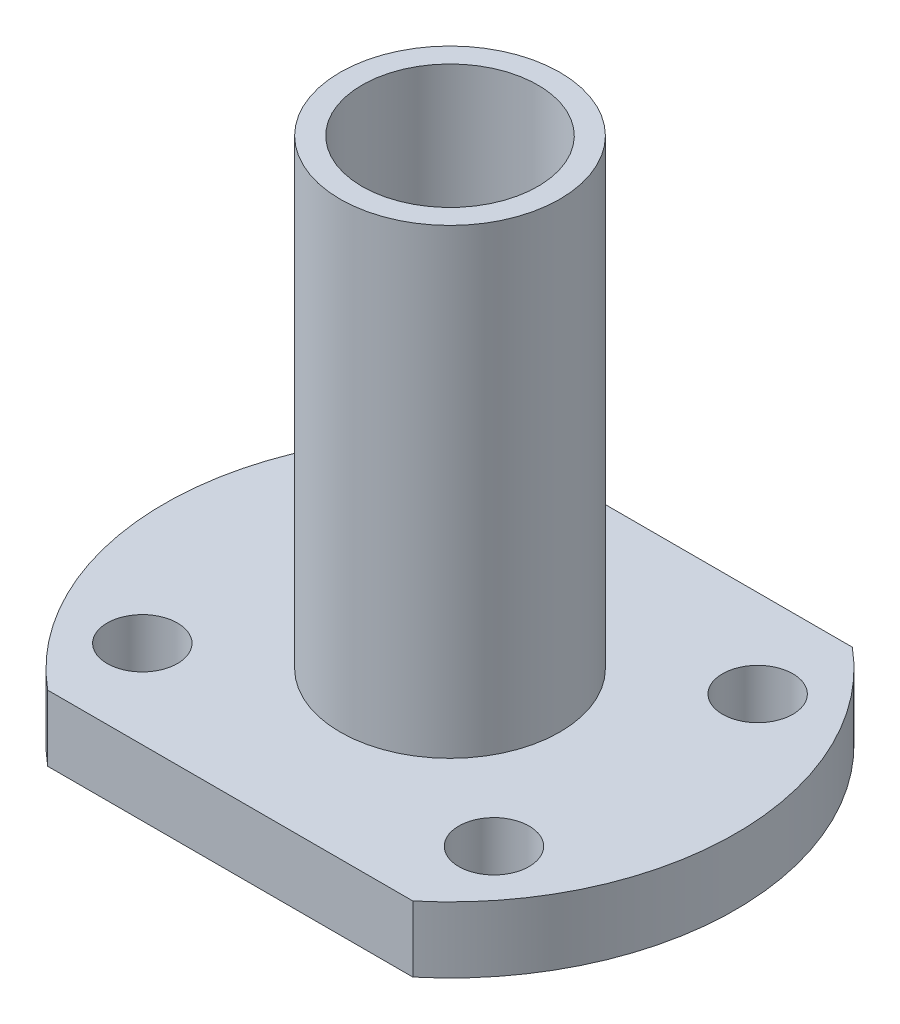
ISO-10303-21;
HEADER;
FILE_DESCRIPTION(('STEP AP214'),'2;1');
FILE_NAME('part.step','',(''),(''),'','','');
FILE_SCHEMA(('AUTOMOTIVE_DESIGN { 1 0 10303 214 1 1 1 1 }'));
ENDSEC;
DATA;
#1=APPLICATION_CONTEXT('core data for automotive mechanical design processes');
#2=APPLICATION_PROTOCOL_DEFINITION('international standard','automotive_design',2000,#1);
#3=PRODUCT_CONTEXT('',#1,'mechanical');
#4=PRODUCT('Part','Part','',(#3));
#5=PRODUCT_RELATED_PRODUCT_CATEGORY('part','',(#4));
#6=PRODUCT_DEFINITION_FORMATION('','',#4);
#7=PRODUCT_DEFINITION_CONTEXT('part definition',#1,'design');
#8=PRODUCT_DEFINITION('design','',#6,#7);
#9=PRODUCT_DEFINITION_SHAPE('','',#8);
#10=(LENGTH_UNIT() NAMED_UNIT(*) SI_UNIT(.MILLI.,.METRE.));
#11=(NAMED_UNIT(*) PLANE_ANGLE_UNIT() SI_UNIT($,.RADIAN.));
#12=(NAMED_UNIT(*) SI_UNIT($,.STERADIAN.) SOLID_ANGLE_UNIT());
#13=UNCERTAINTY_MEASURE_WITH_UNIT(LENGTH_MEASURE(1.E-05),#10,'distance_accuracy_value','');
#14=(GEOMETRIC_REPRESENTATION_CONTEXT(3) GLOBAL_UNCERTAINTY_ASSIGNED_CONTEXT((#13)) GLOBAL_UNIT_ASSIGNED_CONTEXT((#10,
#11,#12)) REPRESENTATION_CONTEXT('',''));
#15=CARTESIAN_POINT('',(0.,0.,0.));
#16=DIRECTION('',(0.,0.,1.));
#17=DIRECTION('',(1.,0.,0.));
#18=AXIS2_PLACEMENT_3D('',#15,#16,#17);
#19=CARTESIAN_POINT('',(0.,24.,0.));
#20=DIRECTION('',(0.,-1.,0.));
#21=DIRECTION('',(0.,0.,-1.));
#22=AXIS2_PLACEMENT_3D('',#19,#20,#21);
#23=CYLINDRICAL_SURFACE('',#22,5.);
#24=CARTESIAN_POINT('',(0.,3.,0.));
#25=DIRECTION('',(0.,1.,0.));
#26=DIRECTION('',(0.,0.,1.));
#27=AXIS2_PLACEMENT_3D('',#24,#25,#26);
#28=CIRCLE('',#27,5.);
#29=CARTESIAN_POINT('',(0.,3.,5.));
#30=VERTEX_POINT('',#29);
#31=EDGE_CURVE('E40',#30,#30,#28,.T.);
#32=ORIENTED_EDGE('',*,*,#31,.T.);
#33=EDGE_LOOP('',(#32));
#34=FACE_BOUND('',#33,.T.);
#35=CARTESIAN_POINT('',(0.,24.,0.));
#36=DIRECTION('',(0.,1.,0.));
#37=DIRECTION('',(0.,0.,1.));
#38=AXIS2_PLACEMENT_3D('',#35,#36,#37);
#39=CIRCLE('',#38,5.);
#40=CARTESIAN_POINT('',(0.,24.,5.));
#41=VERTEX_POINT('',#40);
#42=EDGE_CURVE('E11',#41,#41,#39,.T.);
#43=ORIENTED_EDGE('',*,*,#42,.F.);
#44=EDGE_LOOP('',(#43));
#45=FACE_BOUND('',#44,.T.);
#46=ADVANCED_FACE('F37',(#34,#45),#23,.T.);
#47=CARTESIAN_POINT('',(0.,24.,0.));
#48=DIRECTION('',(0.,1.,0.));
#49=DIRECTION('',(0.,0.,1.));
#50=AXIS2_PLACEMENT_3D('',#47,#48,#49);
#51=PLANE('',#50);
#52=CARTESIAN_POINT('',(0.,24.,0.));
#53=DIRECTION('',(0.,1.,0.));
#54=DIRECTION('',(0.,0.,1.));
#55=AXIS2_PLACEMENT_3D('',#52,#53,#54);
#56=CIRCLE('',#55,4.);
#57=CARTESIAN_POINT('',(0.,24.,4.));
#58=VERTEX_POINT('',#57);
#59=EDGE_CURVE('E258',#58,#58,#56,.T.);
#60=ORIENTED_EDGE('',*,*,#59,.F.);
#61=EDGE_LOOP('',(#60));
#62=FACE_BOUND('',#61,.T.);
#63=ORIENTED_EDGE('',*,*,#42,.T.);
#64=EDGE_LOOP('',(#63));
#65=FACE_BOUND('',#64,.T.);
#66=ADVANCED_FACE('F132',(#62,#65),#51,.T.);
#67=CARTESIAN_POINT('',(0.,3.,10.));
#68=DIRECTION('',(0.,0.,-1.));
#69=DIRECTION('',(-1.,0.,0.));
#70=AXIS2_PLACEMENT_3D('',#67,#68,#69);
#71=PLANE('',#70);
#72=DIRECTION('',(1.,0.,0.));
#73=VECTOR('',#72,1.);
#74=CARTESIAN_POINT('',(0.,0.,10.));
#75=LINE('',#74,#73);
#76=CARTESIAN_POINT('',(-8.30662386291808,0.,10.));
#77=VERTEX_POINT('',#76);
#78=CARTESIAN_POINT('',(8.30662386291808,0.,10.));
#79=VERTEX_POINT('',#78);
#80=EDGE_CURVE('E102',#77,#79,#75,.T.);
#81=ORIENTED_EDGE('',*,*,#80,.T.);
#82=DIRECTION('',(0.,-1.,0.));
#83=VECTOR('',#82,1.);
#84=CARTESIAN_POINT('',(8.30662386291808,3.,10.));
#85=LINE('',#84,#83);
#86=CARTESIAN_POINT('',(8.30662386291808,3.,10.));
#87=VERTEX_POINT('',#86);
#88=EDGE_CURVE('E95',#87,#79,#85,.T.);
#89=ORIENTED_EDGE('',*,*,#88,.F.);
#90=DIRECTION('',(1.,0.,0.));
#91=VECTOR('',#90,1.);
#92=CARTESIAN_POINT('',(0.,3.,10.));
#93=LINE('',#92,#91);
#94=CARTESIAN_POINT('',(-8.30662386291808,3.,10.));
#95=VERTEX_POINT('',#94);
#96=EDGE_CURVE('E85',#95,#87,#93,.T.);
#97=ORIENTED_EDGE('',*,*,#96,.F.);
#98=DIRECTION('',(0.,-1.,0.));
#99=VECTOR('',#98,1.);
#100=CARTESIAN_POINT('',(-8.30662386291808,3.,10.));
#101=LINE('',#100,#99);
#102=EDGE_CURVE('E99',#95,#77,#101,.T.);
#103=ORIENTED_EDGE('',*,*,#102,.T.);
#104=EDGE_LOOP('',(#81,#89,#97,#103));
#105=FACE_BOUND('',#104,.T.);
#106=ADVANCED_FACE('F136',(#105),#71,.F.);
#107=CARTESIAN_POINT('',(0.,3.,0.));
#108=DIRECTION('',(0.,-1.,0.));
#109=DIRECTION('',(0.,0.,-1.));
#110=AXIS2_PLACEMENT_3D('',#107,#108,#109);
#111=CYLINDRICAL_SURFACE('',#110,13.);
#112=CARTESIAN_POINT('',(0.,0.,0.));
#113=DIRECTION('',(0.,1.,0.));
#114=DIRECTION('',(0.,0.,1.));
#115=AXIS2_PLACEMENT_3D('',#112,#113,#114);
#116=CIRCLE('',#115,13.);
#117=CARTESIAN_POINT('',(8.30662386291808,0.,-10.));
#118=VERTEX_POINT('',#117);
#119=EDGE_CURVE('E91',#79,#118,#116,.T.);
#120=ORIENTED_EDGE('',*,*,#119,.T.);
#121=DIRECTION('',(0.,-1.,0.));
#122=VECTOR('',#121,1.);
#123=CARTESIAN_POINT('',(8.30662386291808,3.,-10.));
#124=LINE('',#123,#122);
#125=CARTESIAN_POINT('',(8.30662386291808,3.,-10.));
#126=VERTEX_POINT('',#125);
#127=EDGE_CURVE('E89',#126,#118,#124,.T.);
#128=ORIENTED_EDGE('',*,*,#127,.F.);
#129=CARTESIAN_POINT('',(0.,3.,0.));
#130=DIRECTION('',(0.,1.,0.));
#131=DIRECTION('',(0.,0.,1.));
#132=AXIS2_PLACEMENT_3D('',#129,#130,#131);
#133=CIRCLE('',#132,13.);
#134=EDGE_CURVE('E80',#87,#126,#133,.T.);
#135=ORIENTED_EDGE('',*,*,#134,.F.);
#136=ORIENTED_EDGE('',*,*,#88,.T.);
#137=EDGE_LOOP('',(#120,#128,#135,#136));
#138=FACE_BOUND('',#137,.T.);
#139=ADVANCED_FACE('F90',(#138),#111,.T.);
#140=CARTESIAN_POINT('',(0.,3.,-10.));
#141=DIRECTION('',(0.,0.,-1.));
#142=DIRECTION('',(-1.,0.,0.));
#143=AXIS2_PLACEMENT_3D('',#140,#141,#142);
#144=PLANE('',#143);
#145=DIRECTION('',(1.,0.,0.));
#146=VECTOR('',#145,1.);
#147=CARTESIAN_POINT('',(0.,0.,-10.));
#148=LINE('',#147,#146);
#149=CARTESIAN_POINT('',(-8.30662386291808,0.,-10.));
#150=VERTEX_POINT('',#149);
#151=EDGE_CURVE('E107',#150,#118,#148,.T.);
#152=ORIENTED_EDGE('',*,*,#151,.F.);
#153=DIRECTION('',(0.,-1.,0.));
#154=VECTOR('',#153,1.);
#155=CARTESIAN_POINT('',(-8.30662386291808,3.,-10.));
#156=LINE('',#155,#154);
#157=CARTESIAN_POINT('',(-8.30662386291808,3.,-10.));
#158=VERTEX_POINT('',#157);
#159=EDGE_CURVE('E69',#158,#150,#156,.T.);
#160=ORIENTED_EDGE('',*,*,#159,.F.);
#161=DIRECTION('',(1.,0.,0.));
#162=VECTOR('',#161,1.);
#163=CARTESIAN_POINT('',(0.,3.,-10.));
#164=LINE('',#163,#162);
#165=EDGE_CURVE('E83',#158,#126,#164,.T.);
#166=ORIENTED_EDGE('',*,*,#165,.T.);
#167=ORIENTED_EDGE('',*,*,#127,.T.);
#168=EDGE_LOOP('',(#152,#160,#166,#167));
#169=FACE_BOUND('',#168,.T.);
#170=ADVANCED_FACE('F97',(#169),#144,.T.);
#171=EDGE_CURVE('E72',#150,#77,#116,.T.);
#172=ORIENTED_EDGE('',*,*,#171,.T.);
#173=ORIENTED_EDGE('',*,*,#102,.F.);
#174=EDGE_CURVE('E53',#158,#95,#133,.T.);
#175=ORIENTED_EDGE('',*,*,#174,.F.);
#176=ORIENTED_EDGE('',*,*,#159,.T.);
#177=EDGE_LOOP('',(#172,#173,#175,#176));
#178=FACE_BOUND('',#177,.T.);
#179=ADVANCED_FACE('F118',(#178),#111,.T.);
#180=CARTESIAN_POINT('',(0.,3.,0.));
#181=DIRECTION('',(0.,1.,0.));
#182=DIRECTION('',(0.,0.,1.));
#183=AXIS2_PLACEMENT_3D('',#180,#181,#182);
#184=PLANE('',#183);
#185=CARTESIAN_POINT('',(8.,3.,6.));
#186=DIRECTION('',(0.,1.,0.));
#187=DIRECTION('',(0.,0.,1.));
#188=AXIS2_PLACEMENT_3D('',#185,#186,#187);
#189=CIRCLE('',#188,1.6);
#190=CARTESIAN_POINT('',(8.,3.,7.6));
#191=VERTEX_POINT('',#190);
#192=EDGE_CURVE('E236',#191,#191,#189,.T.);
#193=ORIENTED_EDGE('',*,*,#192,.F.);
#194=EDGE_LOOP('',(#193));
#195=FACE_BOUND('',#194,.T.);
#196=CARTESIAN_POINT('',(8.,3.,-6.));
#197=DIRECTION('',(0.,1.,0.));
#198=DIRECTION('',(0.,0.,1.));
#199=AXIS2_PLACEMENT_3D('',#196,#197,#198);
#200=CIRCLE('',#199,1.6);
#201=CARTESIAN_POINT('',(8.,3.,-4.4));
#202=VERTEX_POINT('',#201);
#203=EDGE_CURVE('E238',#202,#202,#200,.T.);
#204=ORIENTED_EDGE('',*,*,#203,.F.);
#205=EDGE_LOOP('',(#204));
#206=FACE_BOUND('',#205,.T.);
#207=CARTESIAN_POINT('',(-8.,3.,-6.));
#208=DIRECTION('',(0.,1.,0.));
#209=DIRECTION('',(0.,0.,1.));
#210=AXIS2_PLACEMENT_3D('',#207,#208,#209);
#211=CIRCLE('',#210,1.6);
#212=CARTESIAN_POINT('',(-8.,3.,-4.4));
#213=VERTEX_POINT('',#212);
#214=EDGE_CURVE('E246',#213,#213,#211,.T.);
#215=ORIENTED_EDGE('',*,*,#214,.F.);
#216=EDGE_LOOP('',(#215));
#217=FACE_BOUND('',#216,.T.);
#218=CARTESIAN_POINT('',(-8.,3.,6.));
#219=DIRECTION('',(0.,1.,0.));
#220=DIRECTION('',(0.,0.,1.));
#221=AXIS2_PLACEMENT_3D('',#218,#219,#220);
#222=CIRCLE('',#221,1.6);
#223=CARTESIAN_POINT('',(-8.,3.,7.6));
#224=VERTEX_POINT('',#223);
#225=EDGE_CURVE('E252',#224,#224,#222,.T.);
#226=ORIENTED_EDGE('',*,*,#225,.F.);
#227=EDGE_LOOP('',(#226));
#228=FACE_BOUND('',#227,.T.);
#229=ORIENTED_EDGE('',*,*,#31,.F.);
#230=EDGE_LOOP('',(#229));
#231=FACE_BOUND('',#230,.T.);
#232=ORIENTED_EDGE('',*,*,#96,.T.);
#233=ORIENTED_EDGE('',*,*,#134,.T.);
#234=ORIENTED_EDGE('',*,*,#165,.F.);
#235=ORIENTED_EDGE('',*,*,#174,.T.);
#236=EDGE_LOOP('',(#232,#233,#234,#235));
#237=FACE_BOUND('',#236,.T.);
#238=ADVANCED_FACE('F81',(#195,#206,#217,#228,#231,#237),#184,.T.);
#239=CARTESIAN_POINT('',(0.,0.,0.));
#240=DIRECTION('',(0.,1.,0.));
#241=DIRECTION('',(0.,0.,1.));
#242=AXIS2_PLACEMENT_3D('',#239,#240,#241);
#243=PLANE('',#242);
#244=CARTESIAN_POINT('',(8.,0.,6.));
#245=DIRECTION('',(0.,1.,0.));
#246=DIRECTION('',(0.,0.,1.));
#247=AXIS2_PLACEMENT_3D('',#244,#245,#246);
#248=CIRCLE('',#247,1.6);
#249=CARTESIAN_POINT('',(8.,0.,7.6));
#250=VERTEX_POINT('',#249);
#251=EDGE_CURVE('E234',#250,#250,#248,.T.);
#252=ORIENTED_EDGE('',*,*,#251,.T.);
#253=EDGE_LOOP('',(#252));
#254=FACE_BOUND('',#253,.T.);
#255=CARTESIAN_POINT('',(8.,0.,-6.));
#256=DIRECTION('',(0.,1.,0.));
#257=DIRECTION('',(0.,0.,1.));
#258=AXIS2_PLACEMENT_3D('',#255,#256,#257);
#259=CIRCLE('',#258,1.6);
#260=CARTESIAN_POINT('',(8.,0.,-4.4));
#261=VERTEX_POINT('',#260);
#262=EDGE_CURVE('E243',#261,#261,#259,.T.);
#263=ORIENTED_EDGE('',*,*,#262,.T.);
#264=EDGE_LOOP('',(#263));
#265=FACE_BOUND('',#264,.T.);
#266=CARTESIAN_POINT('',(-8.,0.,-6.));
#267=DIRECTION('',(0.,1.,0.));
#268=DIRECTION('',(0.,0.,1.));
#269=AXIS2_PLACEMENT_3D('',#266,#267,#268);
#270=CIRCLE('',#269,1.6);
#271=CARTESIAN_POINT('',(-8.,0.,-4.4));
#272=VERTEX_POINT('',#271);
#273=EDGE_CURVE('E249',#272,#272,#270,.T.);
#274=ORIENTED_EDGE('',*,*,#273,.T.);
#275=EDGE_LOOP('',(#274));
#276=FACE_BOUND('',#275,.T.);
#277=CARTESIAN_POINT('',(-8.,0.,6.));
#278=DIRECTION('',(0.,1.,0.));
#279=DIRECTION('',(0.,0.,1.));
#280=AXIS2_PLACEMENT_3D('',#277,#278,#279);
#281=CIRCLE('',#280,1.6);
#282=CARTESIAN_POINT('',(-8.,0.,7.6));
#283=VERTEX_POINT('',#282);
#284=EDGE_CURVE('E255',#283,#283,#281,.T.);
#285=ORIENTED_EDGE('',*,*,#284,.T.);
#286=EDGE_LOOP('',(#285));
#287=FACE_BOUND('',#286,.T.);
#288=CARTESIAN_POINT('',(0.,0.,0.));
#289=DIRECTION('',(0.,1.,0.));
#290=DIRECTION('',(0.,0.,1.));
#291=AXIS2_PLACEMENT_3D('',#288,#289,#290);
#292=CIRCLE('',#291,4.);
#293=CARTESIAN_POINT('',(0.,0.,4.));
#294=VERTEX_POINT('',#293);
#295=EDGE_CURVE('E105',#294,#294,#292,.T.);
#296=ORIENTED_EDGE('',*,*,#295,.T.);
#297=EDGE_LOOP('',(#296));
#298=FACE_BOUND('',#297,.T.);
#299=ORIENTED_EDGE('',*,*,#80,.F.);
#300=ORIENTED_EDGE('',*,*,#171,.F.);
#301=ORIENTED_EDGE('',*,*,#151,.T.);
#302=ORIENTED_EDGE('',*,*,#119,.F.);
#303=EDGE_LOOP('',(#299,#300,#301,#302));
#304=FACE_BOUND('',#303,.T.);
#305=ADVANCED_FACE('F117',(#254,#265,#276,#287,#298,#304),#243,.F.);
#306=CARTESIAN_POINT('',(0.,0.,0.));
#307=DIRECTION('',(0.,1.,0.));
#308=DIRECTION('',(0.,0.,1.));
#309=AXIS2_PLACEMENT_3D('',#306,#307,#308);
#310=CYLINDRICAL_SURFACE('',#309,4.);
#311=ORIENTED_EDGE('',*,*,#295,.F.);
#312=EDGE_LOOP('',(#311));
#313=FACE_BOUND('',#312,.T.);
#314=ORIENTED_EDGE('',*,*,#59,.T.);
#315=EDGE_LOOP('',(#314));
#316=FACE_BOUND('',#315,.T.);
#317=ADVANCED_FACE('F125',(#313,#316),#310,.F.);
#318=CARTESIAN_POINT('',(-8.,3.,6.));
#319=DIRECTION('',(0.,1.,0.));
#320=DIRECTION('',(0.,0.,1.));
#321=AXIS2_PLACEMENT_3D('',#318,#319,#320);
#322=CYLINDRICAL_SURFACE('',#321,1.6);
#323=ORIENTED_EDGE('',*,*,#284,.F.);
#324=EDGE_LOOP('',(#323));
#325=FACE_BOUND('',#324,.T.);
#326=ORIENTED_EDGE('',*,*,#225,.T.);
#327=EDGE_LOOP('',(#326));
#328=FACE_BOUND('',#327,.T.);
#329=ADVANCED_FACE('F189',(#325,#328),#322,.F.);
#330=CARTESIAN_POINT('',(-8.,3.,-6.));
#331=DIRECTION('',(0.,1.,0.));
#332=DIRECTION('',(0.,0.,1.));
#333=AXIS2_PLACEMENT_3D('',#330,#331,#332);
#334=CYLINDRICAL_SURFACE('',#333,1.6);
#335=ORIENTED_EDGE('',*,*,#273,.F.);
#336=EDGE_LOOP('',(#335));
#337=FACE_BOUND('',#336,.T.);
#338=ORIENTED_EDGE('',*,*,#214,.T.);
#339=EDGE_LOOP('',(#338));
#340=FACE_BOUND('',#339,.T.);
#341=ADVANCED_FACE('F196',(#337,#340),#334,.F.);
#342=CARTESIAN_POINT('',(8.,3.,-6.));
#343=DIRECTION('',(0.,1.,0.));
#344=DIRECTION('',(0.,0.,1.));
#345=AXIS2_PLACEMENT_3D('',#342,#343,#344);
#346=CYLINDRICAL_SURFACE('',#345,1.6);
#347=ORIENTED_EDGE('',*,*,#262,.F.);
#348=EDGE_LOOP('',(#347));
#349=FACE_BOUND('',#348,.T.);
#350=ORIENTED_EDGE('',*,*,#203,.T.);
#351=EDGE_LOOP('',(#350));
#352=FACE_BOUND('',#351,.T.);
#353=ADVANCED_FACE('F205',(#349,#352),#346,.F.);
#354=CARTESIAN_POINT('',(8.,3.,6.));
#355=DIRECTION('',(0.,1.,0.));
#356=DIRECTION('',(0.,0.,1.));
#357=AXIS2_PLACEMENT_3D('',#354,#355,#356);
#358=CYLINDRICAL_SURFACE('',#357,1.6);
#359=ORIENTED_EDGE('',*,*,#251,.F.);
#360=EDGE_LOOP('',(#359));
#361=FACE_BOUND('',#360,.T.);
#362=ORIENTED_EDGE('',*,*,#192,.T.);
#363=EDGE_LOOP('',(#362));
#364=FACE_BOUND('',#363,.T.);
#365=ADVANCED_FACE('F214',(#361,#364),#358,.F.);
#366=CLOSED_SHELL('',(#46,#66,#106,#139,#170,#179,#238,#305,#317,#329,#341,#353,#365));
#367=MANIFOLD_SOLID_BREP('B2',#366);
#368=ADVANCED_BREP_SHAPE_REPRESENTATION('',(#18,#367),#14);
#369=SHAPE_DEFINITION_REPRESENTATION(#9,#368);
ENDSEC;
END-ISO-10303-21;
